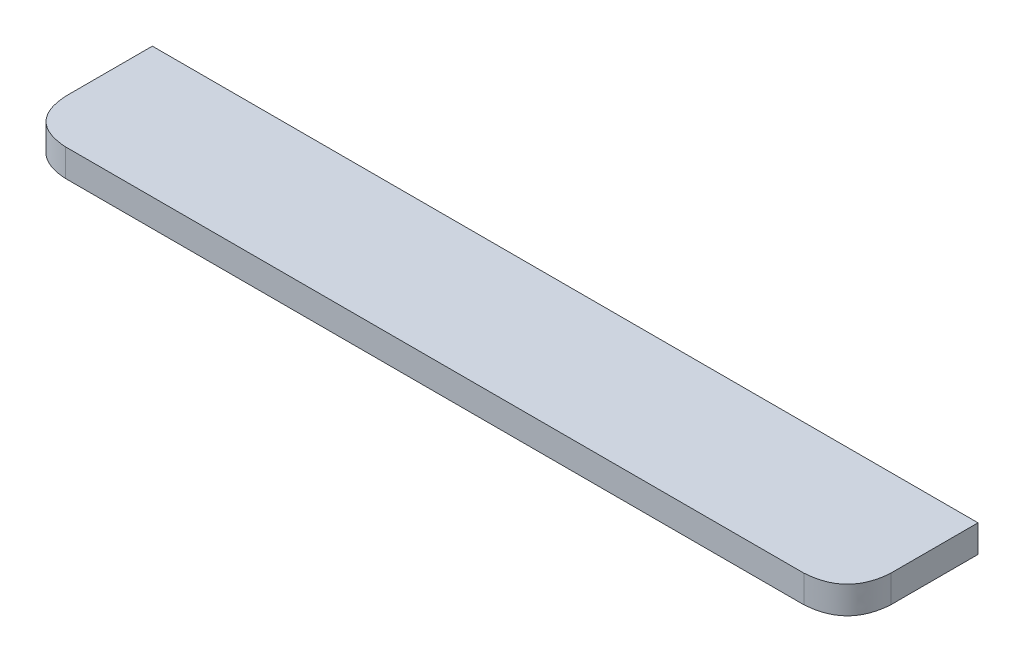
ISO-10303-21;
HEADER;
FILE_DESCRIPTION(('STEP AP214'),'2;1');
FILE_NAME('part.step','',(''),(''),'','','');
FILE_SCHEMA(('AUTOMOTIVE_DESIGN { 1 0 10303 214 1 1 1 1 }'));
ENDSEC;
DATA;
#1=APPLICATION_CONTEXT('core data for automotive mechanical design processes');
#2=APPLICATION_PROTOCOL_DEFINITION('international standard','automotive_design',2000,#1);
#3=PRODUCT_CONTEXT('',#1,'mechanical');
#4=PRODUCT('Part','Part','',(#3));
#5=PRODUCT_RELATED_PRODUCT_CATEGORY('part','',(#4));
#6=PRODUCT_DEFINITION_FORMATION('','',#4);
#7=PRODUCT_DEFINITION_CONTEXT('part definition',#1,'design');
#8=PRODUCT_DEFINITION('design','',#6,#7);
#9=PRODUCT_DEFINITION_SHAPE('','',#8);
#10=(LENGTH_UNIT() NAMED_UNIT(*) SI_UNIT(.MILLI.,.METRE.));
#11=(NAMED_UNIT(*) PLANE_ANGLE_UNIT() SI_UNIT($,.RADIAN.));
#12=(NAMED_UNIT(*) SI_UNIT($,.STERADIAN.) SOLID_ANGLE_UNIT());
#13=UNCERTAINTY_MEASURE_WITH_UNIT(LENGTH_MEASURE(1.E-05),#10,'distance_accuracy_value','');
#14=(GEOMETRIC_REPRESENTATION_CONTEXT(3) GLOBAL_UNCERTAINTY_ASSIGNED_CONTEXT((#13)) GLOBAL_UNIT_ASSIGNED_CONTEXT((#10,
#11,#12)) REPRESENTATION_CONTEXT('',''));
#15=CARTESIAN_POINT('',(0.,0.,0.));
#16=DIRECTION('',(0.,0.,1.));
#17=DIRECTION('',(1.,0.,0.));
#18=AXIS2_PLACEMENT_3D('',#15,#16,#17);
#19=CARTESIAN_POINT('',(120.396,8.,-12.7));
#20=DIRECTION('',(-1.,0.,0.));
#21=DIRECTION('',(0.,0.,1.));
#22=AXIS2_PLACEMENT_3D('',#19,#20,#21);
#23=PLANE('',#22);
#24=DIRECTION('',(0.,0.,-1.));
#25=VECTOR('',#24,1.);
#26=CARTESIAN_POINT('',(120.396,0.,-12.7));
#27=LINE('',#26,#25);
#28=CARTESIAN_POINT('',(120.396,0.,12.7));
#29=VERTEX_POINT('',#28);
#30=CARTESIAN_POINT('',(120.396,0.,-12.7));
#31=VERTEX_POINT('',#30);
#32=EDGE_CURVE('E131',#29,#31,#27,.T.);
#33=ORIENTED_EDGE('',*,*,#32,.T.);
#34=DIRECTION('',(0.,-1.,0.));
#35=VECTOR('',#34,1.);
#36=CARTESIAN_POINT('',(120.396,8.,-12.7));
#37=LINE('',#36,#35);
#38=CARTESIAN_POINT('',(120.396,8.,-12.7));
#39=VERTEX_POINT('',#38);
#40=EDGE_CURVE('E11',#39,#31,#37,.T.);
#41=ORIENTED_EDGE('',*,*,#40,.F.);
#42=DIRECTION('',(0.,0.,-1.));
#43=VECTOR('',#42,1.);
#44=CARTESIAN_POINT('',(120.396,8.,-12.7));
#45=LINE('',#44,#43);
#46=CARTESIAN_POINT('',(120.396,8.,12.7));
#47=VERTEX_POINT('',#46);
#48=EDGE_CURVE('E176',#47,#39,#45,.T.);
#49=ORIENTED_EDGE('',*,*,#48,.F.);
#50=DIRECTION('',(0.,-1.,0.));
#51=VECTOR('',#50,1.);
#52=CARTESIAN_POINT('',(120.396,8.,12.7));
#53=LINE('',#52,#51);
#54=EDGE_CURVE('E121',#47,#29,#53,.T.);
#55=ORIENTED_EDGE('',*,*,#54,.T.);
#56=EDGE_LOOP('',(#33,#41,#49,#55));
#57=FACE_BOUND('',#56,.T.);
#58=ADVANCED_FACE('F41',(#57),#23,.F.);
#59=CARTESIAN_POINT('',(120.396,8.,-12.7));
#60=DIRECTION('',(0.,0.,1.));
#61=DIRECTION('',(1.,0.,0.));
#62=AXIS2_PLACEMENT_3D('',#59,#60,#61);
#63=PLANE('',#62);
#64=DIRECTION('',(-1.,0.,0.));
#65=VECTOR('',#64,1.);
#66=CARTESIAN_POINT('',(120.396,0.,-12.7));
#67=LINE('',#66,#65);
#68=CARTESIAN_POINT('',(-120.396,0.,-12.7));
#69=VERTEX_POINT('',#68);
#70=EDGE_CURVE('E156',#31,#69,#67,.T.);
#71=ORIENTED_EDGE('',*,*,#70,.T.);
#72=DIRECTION('',(0.,-1.,0.));
#73=VECTOR('',#72,1.);
#74=CARTESIAN_POINT('',(-120.396,8.,-12.7));
#75=LINE('',#74,#73);
#76=CARTESIAN_POINT('',(-120.396,8.,-12.7));
#77=VERTEX_POINT('',#76);
#78=EDGE_CURVE('E49',#77,#69,#75,.T.);
#79=ORIENTED_EDGE('',*,*,#78,.F.);
#80=DIRECTION('',(-1.,0.,0.));
#81=VECTOR('',#80,1.);
#82=CARTESIAN_POINT('',(120.396,8.,-12.7));
#83=LINE('',#82,#81);
#84=EDGE_CURVE('E94',#39,#77,#83,.T.);
#85=ORIENTED_EDGE('',*,*,#84,.F.);
#86=ORIENTED_EDGE('',*,*,#40,.T.);
#87=EDGE_LOOP('',(#71,#79,#85,#86));
#88=FACE_BOUND('',#87,.T.);
#89=ADVANCED_FACE('F149',(#88),#63,.F.);
#90=CARTESIAN_POINT('',(-120.396,8.,-12.7));
#91=DIRECTION('',(1.,0.,0.));
#92=DIRECTION('',(0.,0.,-1.));
#93=AXIS2_PLACEMENT_3D('',#90,#91,#92);
#94=PLANE('',#93);
#95=DIRECTION('',(0.,0.,1.));
#96=VECTOR('',#95,1.);
#97=CARTESIAN_POINT('',(-120.396,0.,-12.7));
#98=LINE('',#97,#96);
#99=CARTESIAN_POINT('',(-120.396,0.,12.7));
#100=VERTEX_POINT('',#99);
#101=EDGE_CURVE('E163',#69,#100,#98,.T.);
#102=ORIENTED_EDGE('',*,*,#101,.T.);
#103=DIRECTION('',(0.,-1.,0.));
#104=VECTOR('',#103,1.);
#105=CARTESIAN_POINT('',(-120.396,8.,12.7));
#106=LINE('',#105,#104);
#107=CARTESIAN_POINT('',(-120.396,8.,12.7));
#108=VERTEX_POINT('',#107);
#109=EDGE_CURVE('E116',#108,#100,#106,.T.);
#110=ORIENTED_EDGE('',*,*,#109,.F.);
#111=DIRECTION('',(0.,0.,1.));
#112=VECTOR('',#111,1.);
#113=CARTESIAN_POINT('',(-120.396,8.,-12.7));
#114=LINE('',#113,#112);
#115=EDGE_CURVE('E107',#77,#108,#114,.T.);
#116=ORIENTED_EDGE('',*,*,#115,.F.);
#117=ORIENTED_EDGE('',*,*,#78,.T.);
#118=EDGE_LOOP('',(#102,#110,#116,#117));
#119=FACE_BOUND('',#118,.T.);
#120=ADVANCED_FACE('F147',(#119),#94,.F.);
#121=CARTESIAN_POINT('',(-120.396,8.,12.7));
#122=CARTESIAN_POINT('',(-119.665722486981,8.,24.669722486981));
#123=CARTESIAN_POINT('',(-107.696,8.,25.4));
#124=B_SPLINE_CURVE_WITH_KNOTS('',2,(#121,#122,#123),.UNSPECIFIED.,.F.,.F.,(3,3),(0.,1.),.UNSPECIFIED.);
#125=DIRECTION('',(0.,-1.,0.));
#126=VECTOR('',#125,1.);
#127=SURFACE_OF_LINEAR_EXTRUSION('',#124,#126);
#128=CARTESIAN_POINT('',(-120.396,0.,12.7));
#129=CARTESIAN_POINT('',(-119.665722486981,0.,24.669722486981));
#130=CARTESIAN_POINT('',(-107.696,0.,25.4));
#131=B_SPLINE_CURVE_WITH_KNOTS('',2,(#128,#129,#130),.UNSPECIFIED.,.F.,.F.,(3,3),(0.,1.),.UNSPECIFIED.);
#132=CARTESIAN_POINT('',(-107.696,0.,25.4));
#133=VERTEX_POINT('',#132);
#134=EDGE_CURVE('E115',#100,#133,#131,.T.);
#135=ORIENTED_EDGE('',*,*,#134,.T.);
#136=DIRECTION('',(0.,-1.,0.));
#137=VECTOR('',#136,1.);
#138=CARTESIAN_POINT('',(-107.696,8.,25.4));
#139=LINE('',#138,#137);
#140=CARTESIAN_POINT('',(-107.696,8.,25.4));
#141=VERTEX_POINT('',#140);
#142=EDGE_CURVE('E112',#141,#133,#139,.T.);
#143=ORIENTED_EDGE('',*,*,#142,.F.);
#144=EDGE_CURVE('E101',#108,#141,#124,.T.);
#145=ORIENTED_EDGE('',*,*,#144,.F.);
#146=ORIENTED_EDGE('',*,*,#109,.T.);
#147=EDGE_LOOP('',(#135,#143,#145,#146));
#148=FACE_BOUND('',#147,.T.);
#149=ADVANCED_FACE('F113',(#148),#127,.F.);
#150=CARTESIAN_POINT('',(-107.696,8.,25.4));
#151=DIRECTION('',(0.,0.,-1.));
#152=DIRECTION('',(-1.,0.,0.));
#153=AXIS2_PLACEMENT_3D('',#150,#151,#152);
#154=PLANE('',#153);
#155=DIRECTION('',(1.,0.,0.));
#156=VECTOR('',#155,1.);
#157=CARTESIAN_POINT('',(-107.696,0.,25.4));
#158=LINE('',#157,#156);
#159=CARTESIAN_POINT('',(107.696,0.,25.4));
#160=VERTEX_POINT('',#159);
#161=EDGE_CURVE('E80',#133,#160,#158,.T.);
#162=ORIENTED_EDGE('',*,*,#161,.T.);
#163=DIRECTION('',(0.,-1.,0.));
#164=VECTOR('',#163,1.);
#165=CARTESIAN_POINT('',(107.696,8.,25.4));
#166=LINE('',#165,#164);
#167=CARTESIAN_POINT('',(107.696,8.,25.4));
#168=VERTEX_POINT('',#167);
#169=EDGE_CURVE('E117',#168,#160,#166,.T.);
#170=ORIENTED_EDGE('',*,*,#169,.F.);
#171=DIRECTION('',(1.,0.,0.));
#172=VECTOR('',#171,1.);
#173=CARTESIAN_POINT('',(-107.696,8.,25.4));
#174=LINE('',#173,#172);
#175=EDGE_CURVE('E105',#141,#168,#174,.T.);
#176=ORIENTED_EDGE('',*,*,#175,.F.);
#177=ORIENTED_EDGE('',*,*,#142,.T.);
#178=EDGE_LOOP('',(#162,#170,#176,#177));
#179=FACE_BOUND('',#178,.T.);
#180=ADVANCED_FACE('F119',(#179),#154,.F.);
#181=CARTESIAN_POINT('',(107.696,8.,25.4));
#182=CARTESIAN_POINT('',(119.665722486981,8.,24.669722486981));
#183=CARTESIAN_POINT('',(120.396,8.,12.7));
#184=B_SPLINE_CURVE_WITH_KNOTS('',2,(#181,#182,#183),.UNSPECIFIED.,.F.,.F.,(3,3),(0.,1.),.UNSPECIFIED.);
#185=DIRECTION('',(0.,-1.,0.));
#186=VECTOR('',#185,1.);
#187=SURFACE_OF_LINEAR_EXTRUSION('',#184,#186);
#188=CARTESIAN_POINT('',(107.696,0.,25.4));
#189=CARTESIAN_POINT('',(119.665722486981,0.,24.669722486981));
#190=CARTESIAN_POINT('',(120.396,0.,12.7));
#191=B_SPLINE_CURVE_WITH_KNOTS('',2,(#188,#189,#190),.UNSPECIFIED.,.F.,.F.,(3,3),(0.,1.),.UNSPECIFIED.);
#192=EDGE_CURVE('E86',#160,#29,#191,.T.);
#193=ORIENTED_EDGE('',*,*,#192,.T.);
#194=ORIENTED_EDGE('',*,*,#54,.F.);
#195=EDGE_CURVE('E57',#168,#47,#184,.T.);
#196=ORIENTED_EDGE('',*,*,#195,.F.);
#197=ORIENTED_EDGE('',*,*,#169,.T.);
#198=EDGE_LOOP('',(#193,#194,#196,#197));
#199=FACE_BOUND('',#198,.T.);
#200=ADVANCED_FACE('F137',(#199),#187,.F.);
#201=CARTESIAN_POINT('',(116.855861243491,8.,21.8598612434905));
#202=DIRECTION('',(0.,-1.,0.));
#203=DIRECTION('',(0.,0.,-1.));
#204=AXIS2_PLACEMENT_3D('',#201,#202,#203);
#205=PLANE('',#204);
#206=ORIENTED_EDGE('',*,*,#48,.T.);
#207=ORIENTED_EDGE('',*,*,#84,.T.);
#208=ORIENTED_EDGE('',*,*,#115,.T.);
#209=ORIENTED_EDGE('',*,*,#144,.T.);
#210=ORIENTED_EDGE('',*,*,#175,.T.);
#211=ORIENTED_EDGE('',*,*,#195,.T.);
#212=EDGE_LOOP('',(#206,#207,#208,#209,#210,#211));
#213=FACE_BOUND('',#212,.T.);
#214=ADVANCED_FACE('F103',(#213),#205,.F.);
#215=CARTESIAN_POINT('',(116.855861243491,0.,21.8598612434905));
#216=DIRECTION('',(0.,-1.,0.));
#217=DIRECTION('',(0.,0.,-1.));
#218=AXIS2_PLACEMENT_3D('',#215,#216,#217);
#219=PLANE('',#218);
#220=ORIENTED_EDGE('',*,*,#32,.F.);
#221=ORIENTED_EDGE('',*,*,#192,.F.);
#222=ORIENTED_EDGE('',*,*,#161,.F.);
#223=ORIENTED_EDGE('',*,*,#134,.F.);
#224=ORIENTED_EDGE('',*,*,#101,.F.);
#225=ORIENTED_EDGE('',*,*,#70,.F.);
#226=EDGE_LOOP('',(#220,#221,#222,#223,#224,#225));
#227=FACE_BOUND('',#226,.T.);
#228=ADVANCED_FACE('F141',(#227),#219,.T.);
#229=CLOSED_SHELL('',(#58,#89,#120,#149,#180,#200,#214,#228));
#230=MANIFOLD_SOLID_BREP('B2',#229);
#231=ADVANCED_BREP_SHAPE_REPRESENTATION('',(#18,#230),#14);
#232=SHAPE_DEFINITION_REPRESENTATION(#9,#231);
ENDSEC;
END-ISO-10303-21;
